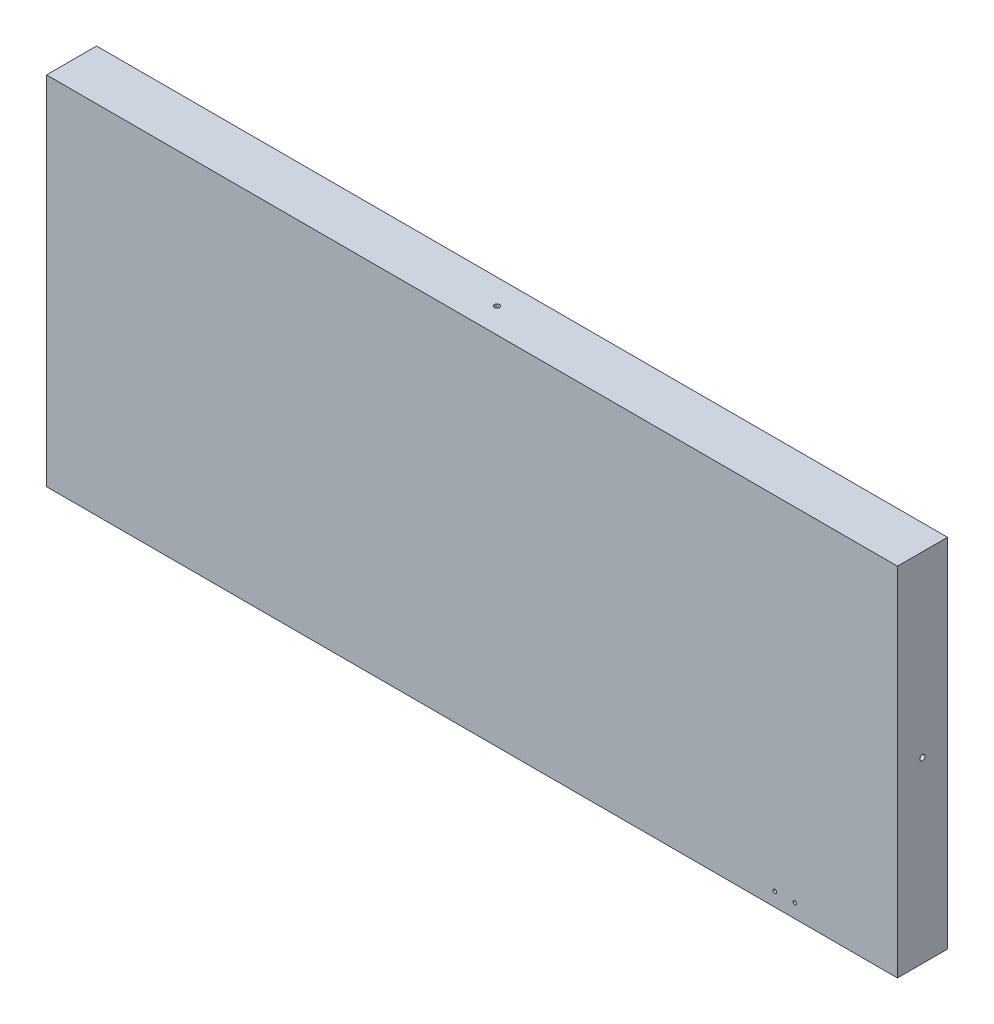
ISO-10303-21;
HEADER;
FILE_DESCRIPTION(('STEP AP214'),'2;1');
FILE_NAME('part.step','',(''),(''),'','','');
FILE_SCHEMA(('AUTOMOTIVE_DESIGN { 1 0 10303 214 1 1 1 1 }'));
ENDSEC;
DATA;
#1=APPLICATION_CONTEXT('core data for automotive mechanical design processes');
#2=APPLICATION_PROTOCOL_DEFINITION('international standard','automotive_design',2000,#1);
#3=PRODUCT_CONTEXT('',#1,'mechanical');
#4=PRODUCT('Part','Part','',(#3));
#5=PRODUCT_RELATED_PRODUCT_CATEGORY('part','',(#4));
#6=PRODUCT_DEFINITION_FORMATION('','',#4);
#7=PRODUCT_DEFINITION_CONTEXT('part definition',#1,'design');
#8=PRODUCT_DEFINITION('design','',#6,#7);
#9=PRODUCT_DEFINITION_SHAPE('','',#8);
#10=(LENGTH_UNIT() NAMED_UNIT(*) SI_UNIT(.MILLI.,.METRE.));
#11=(NAMED_UNIT(*) PLANE_ANGLE_UNIT() SI_UNIT($,.RADIAN.));
#12=(NAMED_UNIT(*) SI_UNIT($,.STERADIAN.) SOLID_ANGLE_UNIT());
#13=UNCERTAINTY_MEASURE_WITH_UNIT(LENGTH_MEASURE(1.E-05),#10,'distance_accuracy_value','');
#14=(GEOMETRIC_REPRESENTATION_CONTEXT(3) GLOBAL_UNCERTAINTY_ASSIGNED_CONTEXT((#13)) GLOBAL_UNIT_ASSIGNED_CONTEXT((#10,
#11,#12)) REPRESENTATION_CONTEXT('',''));
#15=CARTESIAN_POINT('',(0.,0.,0.));
#16=DIRECTION('',(0.,0.,1.));
#17=DIRECTION('',(1.,0.,0.));
#18=AXIS2_PLACEMENT_3D('',#15,#16,#17);
#19=CARTESIAN_POINT('',(0.,-142.5,20.));
#20=DIRECTION('',(0.,-1.,0.));
#21=DIRECTION('',(0.,0.,-1.));
#22=AXIS2_PLACEMENT_3D('',#19,#20,#21);
#23=CYLINDRICAL_SURFACE('',#22,2.09999999999998);
#24=CARTESIAN_POINT('',(0.,-142.5,20.));
#25=DIRECTION('',(0.,-1.,0.));
#26=DIRECTION('',(0.,0.,-1.));
#27=AXIS2_PLACEMENT_3D('',#24,#25,#26);
#28=CIRCLE('',#27,2.09999999999999);
#29=CARTESIAN_POINT('',(0.,-142.5,17.9));
#30=VERTEX_POINT('',#29);
#31=EDGE_CURVE('E132',#30,#30,#28,.T.);
#32=ORIENTED_EDGE('',*,*,#31,.T.);
#33=EDGE_LOOP('',(#32));
#34=FACE_BOUND('',#33,.T.);
#35=CARTESIAN_POINT('',(0.,0.,20.));
#36=DIRECTION('',(0.707106781186547,-0.707106781186547,0.));
#37=DIRECTION('',(-0.707106781186547,-0.707106781186547,0.));
#38=AXIS2_PLACEMENT_3D('',#35,#36,#37);
#39=ELLIPSE('',#38,2.96984848098345,2.09999999999996);
#40=CARTESIAN_POINT('',(0.,0.,17.9));
#41=VERTEX_POINT('',#40);
#42=CARTESIAN_POINT('',(0.,0.,22.1));
#43=VERTEX_POINT('',#42);
#44=EDGE_CURVE('E57',#41,#43,#39,.F.);
#45=ORIENTED_EDGE('',*,*,#44,.T.);
#46=CARTESIAN_POINT('',(0.,0.,20.));
#47=DIRECTION('',(-0.707106781186547,-0.707106781186547,0.));
#48=DIRECTION('',(0.707106781186547,-0.707106781186547,0.));
#49=AXIS2_PLACEMENT_3D('',#46,#47,#48);
#50=ELLIPSE('',#49,2.96984848098345,2.09999999999996);
#51=EDGE_CURVE('E11',#43,#41,#50,.F.);
#52=ORIENTED_EDGE('',*,*,#51,.T.);
#53=EDGE_LOOP('',(#45,#52));
#54=FACE_BOUND('',#53,.T.);
#55=ADVANCED_FACE('F44',(#34,#54),#23,.F.);
#56=CARTESIAN_POINT('',(340.,142.5,40.));
#57=DIRECTION('',(-1.,0.,0.));
#58=DIRECTION('',(0.,-1.,0.));
#59=AXIS2_PLACEMENT_3D('',#56,#57,#58);
#60=PLANE('',#59);
#61=CARTESIAN_POINT('',(340.,0.,20.));
#62=DIRECTION('',(-1.,0.,0.));
#63=DIRECTION('',(0.,0.,1.));
#64=AXIS2_PLACEMENT_3D('',#61,#62,#63);
#65=CIRCLE('',#64,2.09999999999992);
#66=CARTESIAN_POINT('',(340.,0.,22.0999999999999));
#67=VERTEX_POINT('',#66);
#68=EDGE_CURVE('E129',#67,#67,#65,.T.);
#69=ORIENTED_EDGE('',*,*,#68,.T.);
#70=EDGE_LOOP('',(#69));
#71=FACE_BOUND('',#70,.T.);
#72=DIRECTION('',(0.,1.,0.));
#73=VECTOR('',#72,1.);
#74=CARTESIAN_POINT('',(340.,142.5,0.));
#75=LINE('',#74,#73);
#76=CARTESIAN_POINT('',(340.,-142.5,0.));
#77=VERTEX_POINT('',#76);
#78=CARTESIAN_POINT('',(340.,142.5,0.));
#79=VERTEX_POINT('',#78);
#80=EDGE_CURVE('E138',#77,#79,#75,.T.);
#81=ORIENTED_EDGE('',*,*,#80,.T.);
#82=DIRECTION('',(0.,0.,-1.));
#83=VECTOR('',#82,1.);
#84=CARTESIAN_POINT('',(340.,142.5,40.));
#85=LINE('',#84,#83);
#86=CARTESIAN_POINT('',(340.,142.5,40.));
#87=VERTEX_POINT('',#86);
#88=EDGE_CURVE('E159',#87,#79,#85,.T.);
#89=ORIENTED_EDGE('',*,*,#88,.F.);
#90=DIRECTION('',(0.,1.,0.));
#91=VECTOR('',#90,1.);
#92=CARTESIAN_POINT('',(340.,142.5,40.));
#93=LINE('',#92,#91);
#94=CARTESIAN_POINT('',(340.,-142.5,40.));
#95=VERTEX_POINT('',#94);
#96=EDGE_CURVE('E139',#95,#87,#93,.T.);
#97=ORIENTED_EDGE('',*,*,#96,.F.);
#98=DIRECTION('',(0.,0.,-1.));
#99=VECTOR('',#98,1.);
#100=CARTESIAN_POINT('',(340.,-142.5,40.));
#101=LINE('',#100,#99);
#102=EDGE_CURVE('E145',#95,#77,#101,.T.);
#103=ORIENTED_EDGE('',*,*,#102,.T.);
#104=EDGE_LOOP('',(#81,#89,#97,#103));
#105=FACE_BOUND('',#104,.T.);
#106=ADVANCED_FACE('F46',(#71,#105),#60,.F.);
#107=CARTESIAN_POINT('',(-340.,142.5,40.));
#108=DIRECTION('',(0.,-1.,0.));
#109=DIRECTION('',(0.,0.,-1.));
#110=AXIS2_PLACEMENT_3D('',#107,#108,#109);
#111=PLANE('',#110);
#112=CARTESIAN_POINT('',(0.,142.5,20.));
#113=DIRECTION('',(0.,-1.,0.));
#114=DIRECTION('',(0.,0.,-1.));
#115=AXIS2_PLACEMENT_3D('',#112,#113,#114);
#116=CIRCLE('',#115,2.09999999999996);
#117=CARTESIAN_POINT('',(0.,142.5,17.9));
#118=VERTEX_POINT('',#117);
#119=EDGE_CURVE('E135',#118,#118,#116,.T.);
#120=ORIENTED_EDGE('',*,*,#119,.T.);
#121=EDGE_LOOP('',(#120));
#122=FACE_BOUND('',#121,.T.);
#123=DIRECTION('',(-1.,0.,0.));
#124=VECTOR('',#123,1.);
#125=CARTESIAN_POINT('',(-340.,142.5,0.));
#126=LINE('',#125,#124);
#127=CARTESIAN_POINT('',(-340.,142.5,0.));
#128=VERTEX_POINT('',#127);
#129=EDGE_CURVE('E148',#79,#128,#126,.T.);
#130=ORIENTED_EDGE('',*,*,#129,.T.);
#131=DIRECTION('',(0.,0.,-1.));
#132=VECTOR('',#131,1.);
#133=CARTESIAN_POINT('',(-340.,142.5,40.));
#134=LINE('',#133,#132);
#135=CARTESIAN_POINT('',(-340.,142.5,40.));
#136=VERTEX_POINT('',#135);
#137=EDGE_CURVE('E156',#136,#128,#134,.T.);
#138=ORIENTED_EDGE('',*,*,#137,.F.);
#139=DIRECTION('',(-1.,0.,0.));
#140=VECTOR('',#139,1.);
#141=CARTESIAN_POINT('',(-340.,142.5,40.));
#142=LINE('',#141,#140);
#143=EDGE_CURVE('E95',#87,#136,#142,.T.);
#144=ORIENTED_EDGE('',*,*,#143,.F.);
#145=ORIENTED_EDGE('',*,*,#88,.T.);
#146=EDGE_LOOP('',(#130,#138,#144,#145));
#147=FACE_BOUND('',#146,.T.);
#148=ADVANCED_FACE('F179',(#122,#147),#111,.F.);
#149=CARTESIAN_POINT('',(-340.,142.5,40.));
#150=DIRECTION('',(1.,0.,0.));
#151=DIRECTION('',(0.,1.,0.));
#152=AXIS2_PLACEMENT_3D('',#149,#150,#151);
#153=PLANE('',#152);
#154=CARTESIAN_POINT('',(-340.,0.,20.));
#155=DIRECTION('',(-1.,0.,0.));
#156=DIRECTION('',(0.,0.,1.));
#157=AXIS2_PLACEMENT_3D('',#154,#155,#156);
#158=CIRCLE('',#157,2.09999999999999);
#159=CARTESIAN_POINT('',(-340.,0.,22.1));
#160=VERTEX_POINT('',#159);
#161=EDGE_CURVE('E126',#160,#160,#158,.T.);
#162=ORIENTED_EDGE('',*,*,#161,.F.);
#163=EDGE_LOOP('',(#162));
#164=FACE_BOUND('',#163,.T.);
#165=DIRECTION('',(0.,-1.,0.));
#166=VECTOR('',#165,1.);
#167=CARTESIAN_POINT('',(-340.,142.5,0.));
#168=LINE('',#167,#166);
#169=CARTESIAN_POINT('',(-340.,-142.5,0.));
#170=VERTEX_POINT('',#169);
#171=EDGE_CURVE('E150',#128,#170,#168,.T.);
#172=ORIENTED_EDGE('',*,*,#171,.T.);
#173=DIRECTION('',(0.,0.,-1.));
#174=VECTOR('',#173,1.);
#175=CARTESIAN_POINT('',(-340.,-142.5,40.));
#176=LINE('',#175,#174);
#177=CARTESIAN_POINT('',(-340.,-142.5,40.));
#178=VERTEX_POINT('',#177);
#179=EDGE_CURVE('E154',#178,#170,#176,.T.);
#180=ORIENTED_EDGE('',*,*,#179,.F.);
#181=DIRECTION('',(0.,-1.,0.));
#182=VECTOR('',#181,1.);
#183=CARTESIAN_POINT('',(-340.,142.5,40.));
#184=LINE('',#183,#182);
#185=EDGE_CURVE('E142',#136,#178,#184,.T.);
#186=ORIENTED_EDGE('',*,*,#185,.F.);
#187=ORIENTED_EDGE('',*,*,#137,.T.);
#188=EDGE_LOOP('',(#172,#180,#186,#187));
#189=FACE_BOUND('',#188,.T.);
#190=ADVANCED_FACE('F202',(#164,#189),#153,.F.);
#191=CARTESIAN_POINT('',(-340.,-142.5,40.));
#192=DIRECTION('',(0.,1.,0.));
#193=DIRECTION('',(0.,0.,1.));
#194=AXIS2_PLACEMENT_3D('',#191,#192,#193);
#195=PLANE('',#194);
#196=ORIENTED_EDGE('',*,*,#31,.F.);
#197=EDGE_LOOP('',(#196));
#198=FACE_BOUND('',#197,.T.);
#199=DIRECTION('',(1.,0.,0.));
#200=VECTOR('',#199,1.);
#201=CARTESIAN_POINT('',(-340.,-142.5,0.));
#202=LINE('',#201,#200);
#203=EDGE_CURVE('E87',#170,#77,#202,.T.);
#204=ORIENTED_EDGE('',*,*,#203,.T.);
#205=ORIENTED_EDGE('',*,*,#102,.F.);
#206=DIRECTION('',(1.,0.,0.));
#207=VECTOR('',#206,1.);
#208=CARTESIAN_POINT('',(-340.,-142.5,40.));
#209=LINE('',#208,#207);
#210=EDGE_CURVE('E66',#178,#95,#209,.T.);
#211=ORIENTED_EDGE('',*,*,#210,.F.);
#212=ORIENTED_EDGE('',*,*,#179,.T.);
#213=EDGE_LOOP('',(#204,#205,#211,#212));
#214=FACE_BOUND('',#213,.T.);
#215=ADVANCED_FACE('F196',(#198,#214),#195,.F.);
#216=CARTESIAN_POINT('',(0.,0.,40.));
#217=DIRECTION('',(0.,0.,1.));
#218=DIRECTION('',(1.,0.,0.));
#219=AXIS2_PLACEMENT_3D('',#216,#217,#218);
#220=PLANE('',#219);
#221=CARTESIAN_POINT('',(258.,-131.5,40.));
#222=DIRECTION('',(0.,0.,1.));
#223=DIRECTION('',(1.,0.,0.));
#224=AXIS2_PLACEMENT_3D('',#221,#222,#223);
#225=CIRCLE('',#224,1.45000000000001);
#226=CARTESIAN_POINT('',(259.45,-131.5,40.));
#227=VERTEX_POINT('',#226);
#228=EDGE_CURVE('E116',#227,#227,#225,.T.);
#229=ORIENTED_EDGE('',*,*,#228,.F.);
#230=EDGE_LOOP('',(#229));
#231=FACE_BOUND('',#230,.T.);
#232=CARTESIAN_POINT('',(242.,-131.5,40.));
#233=DIRECTION('',(0.,0.,1.));
#234=DIRECTION('',(1.,0.,0.));
#235=AXIS2_PLACEMENT_3D('',#232,#233,#234);
#236=CIRCLE('',#235,1.44999999999998);
#237=CARTESIAN_POINT('',(243.45,-131.5,40.));
#238=VERTEX_POINT('',#237);
#239=EDGE_CURVE('E115',#238,#238,#236,.T.);
#240=ORIENTED_EDGE('',*,*,#239,.F.);
#241=EDGE_LOOP('',(#240));
#242=FACE_BOUND('',#241,.T.);
#243=ORIENTED_EDGE('',*,*,#96,.T.);
#244=ORIENTED_EDGE('',*,*,#143,.T.);
#245=ORIENTED_EDGE('',*,*,#185,.T.);
#246=ORIENTED_EDGE('',*,*,#210,.T.);
#247=EDGE_LOOP('',(#243,#244,#245,#246));
#248=FACE_BOUND('',#247,.T.);
#249=ADVANCED_FACE('F190',(#231,#242,#248),#220,.T.);
#250=CARTESIAN_POINT('',(0.,0.,0.));
#251=DIRECTION('',(0.,0.,1.));
#252=DIRECTION('',(1.,0.,0.));
#253=AXIS2_PLACEMENT_3D('',#250,#251,#252);
#254=PLANE('',#253);
#255=ORIENTED_EDGE('',*,*,#80,.F.);
#256=ORIENTED_EDGE('',*,*,#203,.F.);
#257=ORIENTED_EDGE('',*,*,#171,.F.);
#258=ORIENTED_EDGE('',*,*,#129,.F.);
#259=EDGE_LOOP('',(#255,#256,#257,#258));
#260=FACE_BOUND('',#259,.T.);
#261=ADVANCED_FACE('F184',(#260),#254,.F.);
#262=CARTESIAN_POINT('',(0.,0.,20.));
#263=DIRECTION('',(0.707106781186547,-0.707106781186547,0.));
#264=DIRECTION('',(-0.707106781186547,-0.707106781186547,0.));
#265=AXIS2_PLACEMENT_3D('',#262,#263,#264);
#266=ELLIPSE('',#265,2.96984848098345,2.09999999999996);
#267=EDGE_CURVE('E162',#41,#43,#266,.T.);
#268=ORIENTED_EDGE('',*,*,#267,.T.);
#269=CARTESIAN_POINT('',(0.,0.,20.));
#270=DIRECTION('',(-0.707106781186547,-0.707106781186547,0.));
#271=DIRECTION('',(0.707106781186547,-0.707106781186547,0.));
#272=AXIS2_PLACEMENT_3D('',#269,#270,#271);
#273=ELLIPSE('',#272,2.96984848098345,2.09999999999996);
#274=EDGE_CURVE('E52',#43,#41,#273,.T.);
#275=ORIENTED_EDGE('',*,*,#274,.T.);
#276=EDGE_LOOP('',(#268,#275));
#277=FACE_BOUND('',#276,.T.);
#278=ORIENTED_EDGE('',*,*,#119,.F.);
#279=EDGE_LOOP('',(#278));
#280=FACE_BOUND('',#279,.T.);
#281=ADVANCED_FACE('F166',(#277,#280),#23,.F.);
#282=CARTESIAN_POINT('',(-340.,0.,20.));
#283=DIRECTION('',(-1.,0.,0.));
#284=DIRECTION('',(0.,0.,1.));
#285=AXIS2_PLACEMENT_3D('',#282,#283,#284);
#286=CYLINDRICAL_SURFACE('',#285,2.09999999999995);
#287=ORIENTED_EDGE('',*,*,#161,.T.);
#288=EDGE_LOOP('',(#287));
#289=FACE_BOUND('',#288,.T.);
#290=ORIENTED_EDGE('',*,*,#44,.F.);
#291=ORIENTED_EDGE('',*,*,#274,.F.);
#292=EDGE_LOOP('',(#290,#291));
#293=FACE_BOUND('',#292,.T.);
#294=ADVANCED_FACE('F170',(#289,#293),#286,.F.);
#295=ORIENTED_EDGE('',*,*,#68,.F.);
#296=EDGE_LOOP('',(#295));
#297=FACE_BOUND('',#296,.T.);
#298=ORIENTED_EDGE('',*,*,#267,.F.);
#299=ORIENTED_EDGE('',*,*,#51,.F.);
#300=EDGE_LOOP('',(#298,#299));
#301=FACE_BOUND('',#300,.T.);
#302=ADVANCED_FACE('F172',(#297,#301),#286,.F.);
#303=CARTESIAN_POINT('',(242.,-131.5,32.6));
#304=DIRECTION('',(0.,0.,1.));
#305=DIRECTION('',(1.,0.,0.));
#306=AXIS2_PLACEMENT_3D('',#303,#304,#305);
#307=CONICAL_SURFACE('',#306,1.45000000000001,1.02974425867665);
#308=CARTESIAN_POINT('',(242.,-131.5,31.72875210241));
#309=VERTEX_POINT('',#308);
#310=VERTEX_LOOP('',#309);
#311=FACE_BOUND('',#310,.T.);
#312=CARTESIAN_POINT('',(242.,-131.5,32.6));
#313=DIRECTION('',(0.,0.,1.));
#314=DIRECTION('',(1.,0.,0.));
#315=AXIS2_PLACEMENT_3D('',#312,#313,#314);
#316=CIRCLE('',#315,1.45000000000001);
#317=CARTESIAN_POINT('',(243.45,-131.5,32.6));
#318=VERTEX_POINT('',#317);
#319=EDGE_CURVE('E119',#318,#318,#316,.T.);
#320=ORIENTED_EDGE('',*,*,#319,.T.);
#321=EDGE_LOOP('',(#320));
#322=FACE_BOUND('',#321,.T.);
#323=ADVANCED_FACE('F245',(#311,#322),#307,.F.);
#324=CARTESIAN_POINT('',(242.,-131.5,40.));
#325=DIRECTION('',(0.,0.,1.));
#326=DIRECTION('',(1.,0.,0.));
#327=AXIS2_PLACEMENT_3D('',#324,#325,#326);
#328=CYLINDRICAL_SURFACE('',#327,1.44999999999999);
#329=ORIENTED_EDGE('',*,*,#319,.F.);
#330=EDGE_LOOP('',(#329));
#331=FACE_BOUND('',#330,.T.);
#332=ORIENTED_EDGE('',*,*,#239,.T.);
#333=EDGE_LOOP('',(#332));
#334=FACE_BOUND('',#333,.T.);
#335=ADVANCED_FACE('F109',(#331,#334),#328,.F.);
#336=CARTESIAN_POINT('',(258.,-131.5,32.6));
#337=DIRECTION('',(0.,0.,1.));
#338=DIRECTION('',(1.,0.,0.));
#339=AXIS2_PLACEMENT_3D('',#336,#337,#338);
#340=CONICAL_SURFACE('',#339,1.45000000000001,1.02974425867665);
#341=CARTESIAN_POINT('',(258.,-131.5,31.72875210241));
#342=VERTEX_POINT('',#341);
#343=VERTEX_LOOP('',#342);
#344=FACE_BOUND('',#343,.T.);
#345=CARTESIAN_POINT('',(258.,-131.5,32.6));
#346=DIRECTION('',(0.,0.,1.));
#347=DIRECTION('',(1.,0.,0.));
#348=AXIS2_PLACEMENT_3D('',#345,#346,#347);
#349=CIRCLE('',#348,1.45000000000001);
#350=CARTESIAN_POINT('',(259.45,-131.5,32.6));
#351=VERTEX_POINT('',#350);
#352=EDGE_CURVE('E113',#351,#351,#349,.T.);
#353=ORIENTED_EDGE('',*,*,#352,.T.);
#354=EDGE_LOOP('',(#353));
#355=FACE_BOUND('',#354,.T.);
#356=ADVANCED_FACE('F105',(#344,#355),#340,.F.);
#357=CARTESIAN_POINT('',(258.,-131.5,40.));
#358=DIRECTION('',(0.,0.,1.));
#359=DIRECTION('',(1.,0.,0.));
#360=AXIS2_PLACEMENT_3D('',#357,#358,#359);
#361=CYLINDRICAL_SURFACE('',#360,1.45000000000001);
#362=ORIENTED_EDGE('',*,*,#352,.F.);
#363=EDGE_LOOP('',(#362));
#364=FACE_BOUND('',#363,.T.);
#365=ORIENTED_EDGE('',*,*,#228,.T.);
#366=EDGE_LOOP('',(#365));
#367=FACE_BOUND('',#366,.T.);
#368=ADVANCED_FACE('F108',(#364,#367),#361,.F.);
#369=CLOSED_SHELL('',(#55,#106,#148,#190,#215,#249,#261,#281,#294,#302,#323,#335,#356,#368));
#370=MANIFOLD_SOLID_BREP('B2',#369);
#371=ADVANCED_BREP_SHAPE_REPRESENTATION('',(#18,#370),#14);
#372=SHAPE_DEFINITION_REPRESENTATION(#9,#371);
ENDSEC;
END-ISO-10303-21;
